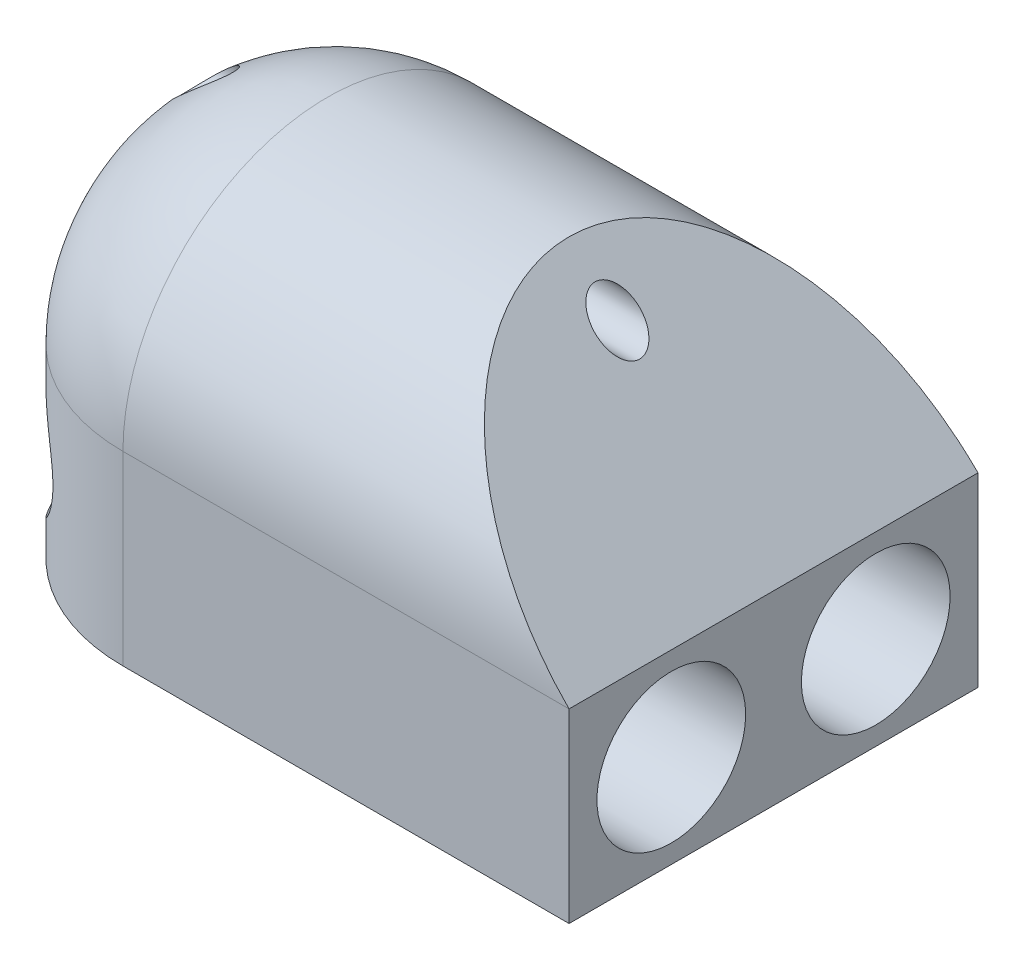
ISO-10303-21;
HEADER;
FILE_DESCRIPTION(('STEP AP214'),'2;1');
FILE_NAME('part.step','',(''),(''),'','','');
FILE_SCHEMA(('AUTOMOTIVE_DESIGN { 1 0 10303 214 1 1 1 1 }'));
ENDSEC;
DATA;
#1=APPLICATION_CONTEXT('core data for automotive mechanical design processes');
#2=APPLICATION_PROTOCOL_DEFINITION('international standard','automotive_design',2000,#1);
#3=PRODUCT_CONTEXT('',#1,'mechanical');
#4=PRODUCT('Part','Part','',(#3));
#5=PRODUCT_RELATED_PRODUCT_CATEGORY('part','',(#4));
#6=PRODUCT_DEFINITION_FORMATION('','',#4);
#7=PRODUCT_DEFINITION_CONTEXT('part definition',#1,'design');
#8=PRODUCT_DEFINITION('design','',#6,#7);
#9=PRODUCT_DEFINITION_SHAPE('','',#8);
#10=(LENGTH_UNIT() NAMED_UNIT(*) SI_UNIT(.MILLI.,.METRE.));
#11=(NAMED_UNIT(*) PLANE_ANGLE_UNIT() SI_UNIT($,.RADIAN.));
#12=(NAMED_UNIT(*) SI_UNIT($,.STERADIAN.) SOLID_ANGLE_UNIT());
#13=UNCERTAINTY_MEASURE_WITH_UNIT(LENGTH_MEASURE(1.E-05),#10,'distance_accuracy_value','');
#14=(GEOMETRIC_REPRESENTATION_CONTEXT(3) GLOBAL_UNCERTAINTY_ASSIGNED_CONTEXT((#13)) GLOBAL_UNIT_ASSIGNED_CONTEXT((#10,
#11,#12)) REPRESENTATION_CONTEXT('',''));
#15=CARTESIAN_POINT('',(0.,0.,0.));
#16=DIRECTION('',(0.,0.,1.));
#17=DIRECTION('',(1.,0.,0.));
#18=AXIS2_PLACEMENT_3D('',#15,#16,#17);
#19=CARTESIAN_POINT('',(0.,6.35,0.));
#20=DIRECTION('',(-1.,0.,0.));
#21=DIRECTION('',(0.,0.,1.));
#22=AXIS2_PLACEMENT_3D('',#19,#20,#21);
#23=PLANE('',#22);
#24=CARTESIAN_POINT('',(0.,3.175,-3.4925));
#25=DIRECTION('',(1.,0.,0.));
#26=DIRECTION('',(0.,0.,-1.));
#27=AXIS2_PLACEMENT_3D('',#24,#25,#26);
#28=CIRCLE('',#27,2.54);
#29=CARTESIAN_POINT('',(0.,3.175,-6.0325));
#30=VERTEX_POINT('',#29);
#31=EDGE_CURVE('E217',#30,#30,#28,.T.);
#32=ORIENTED_EDGE('',*,*,#31,.F.);
#33=EDGE_LOOP('',(#32));
#34=FACE_BOUND('',#33,.T.);
#35=CARTESIAN_POINT('',(0.,3.175,-10.4775));
#36=DIRECTION('',(1.,0.,0.));
#37=DIRECTION('',(0.,0.,1.));
#38=AXIS2_PLACEMENT_3D('',#35,#36,#37);
#39=CIRCLE('',#38,2.54);
#40=CARTESIAN_POINT('',(0.,3.175,-7.9375));
#41=VERTEX_POINT('',#40);
#42=EDGE_CURVE('E148',#41,#41,#39,.T.);
#43=ORIENTED_EDGE('',*,*,#42,.F.);
#44=EDGE_LOOP('',(#43));
#45=FACE_BOUND('',#44,.T.);
#46=DIRECTION('',(0.,-1.,0.));
#47=VECTOR('',#46,1.);
#48=CARTESIAN_POINT('',(0.,6.35,-13.97));
#49=LINE('',#48,#47);
#50=CARTESIAN_POINT('',(0.,6.35,-13.97));
#51=VERTEX_POINT('',#50);
#52=CARTESIAN_POINT('',(0.,0.,-13.97));
#53=VERTEX_POINT('',#52);
#54=EDGE_CURVE('E105',#51,#53,#49,.T.);
#55=ORIENTED_EDGE('',*,*,#54,.F.);
#56=DIRECTION('',(0.,0.,1.));
#57=VECTOR('',#56,1.);
#58=CARTESIAN_POINT('',(0.,6.35,-13.97));
#59=LINE('',#58,#57);
#60=CARTESIAN_POINT('',(0.,6.35,0.));
#61=VERTEX_POINT('',#60);
#62=EDGE_CURVE('E107',#51,#61,#59,.T.);
#63=ORIENTED_EDGE('',*,*,#62,.T.);
#64=DIRECTION('',(0.,-1.,0.));
#65=VECTOR('',#64,1.);
#66=CARTESIAN_POINT('',(0.,6.35,0.));
#67=LINE('',#66,#65);
#68=CARTESIAN_POINT('',(0.,0.,0.));
#69=VERTEX_POINT('',#68);
#70=EDGE_CURVE('E122',#61,#69,#67,.T.);
#71=ORIENTED_EDGE('',*,*,#70,.T.);
#72=DIRECTION('',(0.,0.,-1.));
#73=VECTOR('',#72,1.);
#74=CARTESIAN_POINT('',(0.,0.,0.));
#75=LINE('',#74,#73);
#76=EDGE_CURVE('E113',#69,#53,#75,.T.);
#77=ORIENTED_EDGE('',*,*,#76,.T.);
#78=EDGE_LOOP('',(#55,#63,#71,#77));
#79=FACE_BOUND('',#78,.T.);
#80=ADVANCED_FACE('F35',(#34,#45,#79),#23,.F.);
#81=CARTESIAN_POINT('',(0.,6.35,-13.97));
#82=DIRECTION('',(0.,0.,1.));
#83=DIRECTION('',(1.,0.,0.));
#84=AXIS2_PLACEMENT_3D('',#81,#82,#83);
#85=PLANE('',#84);
#86=DIRECTION('',(-1.,0.,0.));
#87=VECTOR('',#86,1.);
#88=CARTESIAN_POINT('',(0.,0.,-13.97));
#89=LINE('',#88,#87);
#90=CARTESIAN_POINT('',(-15.24,0.,-13.97));
#91=VERTEX_POINT('',#90);
#92=EDGE_CURVE('E222',#53,#91,#89,.T.);
#93=ORIENTED_EDGE('',*,*,#92,.T.);
#94=DIRECTION('',(0.,-1.,0.));
#95=VECTOR('',#94,1.);
#96=CARTESIAN_POINT('',(-15.24,6.35,-13.97));
#97=LINE('',#96,#95);
#98=CARTESIAN_POINT('',(-15.24,6.35,-13.97));
#99=VERTEX_POINT('',#98);
#100=EDGE_CURVE('E50',#91,#99,#97,.F.);
#101=ORIENTED_EDGE('',*,*,#100,.T.);
#102=DIRECTION('',(-1.,0.,0.));
#103=VECTOR('',#102,1.);
#104=CARTESIAN_POINT('',(0.,6.35,-13.97));
#105=LINE('',#104,#103);
#106=EDGE_CURVE('E98',#51,#99,#105,.T.);
#107=ORIENTED_EDGE('',*,*,#106,.F.);
#108=ORIENTED_EDGE('',*,*,#54,.T.);
#109=EDGE_LOOP('',(#93,#101,#107,#108));
#110=FACE_BOUND('',#109,.T.);
#111=ADVANCED_FACE('F117',(#110),#85,.F.);
#112=CARTESIAN_POINT('',(-21.59,6.35,0.));
#113=DIRECTION('',(1.,0.,0.));
#114=DIRECTION('',(0.,0.,-1.));
#115=AXIS2_PLACEMENT_3D('',#112,#113,#114);
#116=PLANE('',#115);
#117=DIRECTION('',(0.,0.,1.));
#118=VECTOR('',#117,1.);
#119=CARTESIAN_POINT('',(-21.59,0.,0.));
#120=LINE('',#119,#118);
#121=CARTESIAN_POINT('',(-21.59,0.,-7.62));
#122=VERTEX_POINT('',#121);
#123=CARTESIAN_POINT('',(-21.59,0.,-6.35));
#124=VERTEX_POINT('',#123);
#125=EDGE_CURVE('E224',#122,#124,#120,.T.);
#126=ORIENTED_EDGE('',*,*,#125,.T.);
#127=DIRECTION('',(0.,-1.,0.));
#128=VECTOR('',#127,1.);
#129=CARTESIAN_POINT('',(-21.59,6.35,-6.35));
#130=LINE('',#129,#128);
#131=CARTESIAN_POINT('',(-21.59,6.35,-6.35));
#132=VERTEX_POINT('',#131);
#133=EDGE_CURVE('E139',#124,#132,#130,.F.);
#134=ORIENTED_EDGE('',*,*,#133,.T.);
#135=CARTESIAN_POINT('',(-21.59,6.35,-6.985));
#136=DIRECTION('',(1.,0.,0.));
#137=DIRECTION('',(0.,0.,-1.));
#138=AXIS2_PLACEMENT_3D('',#135,#136,#137);
#139=CIRCLE('',#138,0.635000000000001);
#140=CARTESIAN_POINT('',(-21.59,6.35,-7.62));
#141=VERTEX_POINT('',#140);
#142=EDGE_CURVE('E65',#132,#141,#139,.F.);
#143=ORIENTED_EDGE('',*,*,#142,.T.);
#144=DIRECTION('',(0.,-1.,0.));
#145=VECTOR('',#144,1.);
#146=CARTESIAN_POINT('',(-21.59,6.35,-7.62));
#147=LINE('',#146,#145);
#148=EDGE_CURVE('E137',#141,#122,#147,.T.);
#149=ORIENTED_EDGE('',*,*,#148,.T.);
#150=EDGE_LOOP('',(#126,#134,#143,#149));
#151=FACE_BOUND('',#150,.T.);
#152=ADVANCED_FACE('F176',(#151),#116,.F.);
#153=CARTESIAN_POINT('',(0.,6.35,0.));
#154=DIRECTION('',(0.,0.,-1.));
#155=DIRECTION('',(-1.,0.,0.));
#156=AXIS2_PLACEMENT_3D('',#153,#154,#155);
#157=PLANE('',#156);
#158=DIRECTION('',(1.,0.,0.));
#159=VECTOR('',#158,1.);
#160=CARTESIAN_POINT('',(0.,6.35,0.));
#161=LINE('',#160,#159);
#162=CARTESIAN_POINT('',(-15.24,6.35,0.));
#163=VERTEX_POINT('',#162);
#164=EDGE_CURVE('E101',#163,#61,#161,.T.);
#165=ORIENTED_EDGE('',*,*,#164,.F.);
#166=DIRECTION('',(0.,-1.,0.));
#167=VECTOR('',#166,1.);
#168=CARTESIAN_POINT('',(-15.24,6.35,0.));
#169=LINE('',#168,#167);
#170=CARTESIAN_POINT('',(-15.24,0.,0.));
#171=VERTEX_POINT('',#170);
#172=EDGE_CURVE('E104',#163,#171,#169,.T.);
#173=ORIENTED_EDGE('',*,*,#172,.T.);
#174=DIRECTION('',(1.,0.,0.));
#175=VECTOR('',#174,1.);
#176=CARTESIAN_POINT('',(0.,0.,0.));
#177=LINE('',#176,#175);
#178=EDGE_CURVE('E119',#171,#69,#177,.T.);
#179=ORIENTED_EDGE('',*,*,#178,.T.);
#180=ORIENTED_EDGE('',*,*,#70,.F.);
#181=EDGE_LOOP('',(#165,#173,#179,#180));
#182=FACE_BOUND('',#181,.T.);
#183=ADVANCED_FACE('F179',(#182),#157,.F.);
#184=CARTESIAN_POINT('',(0.,0.,0.));
#185=DIRECTION('',(0.,1.,0.));
#186=DIRECTION('',(0.,0.,1.));
#187=AXIS2_PLACEMENT_3D('',#184,#185,#186);
#188=PLANE('',#187);
#189=ORIENTED_EDGE('',*,*,#178,.F.);
#190=CARTESIAN_POINT('',(-15.24,0.,-6.35));
#191=DIRECTION('',(0.,1.,0.));
#192=DIRECTION('',(0.,0.,1.));
#193=AXIS2_PLACEMENT_3D('',#190,#191,#192);
#194=CIRCLE('',#193,6.35);
#195=EDGE_CURVE('E134',#171,#124,#194,.F.);
#196=ORIENTED_EDGE('',*,*,#195,.T.);
#197=ORIENTED_EDGE('',*,*,#125,.F.);
#198=CARTESIAN_POINT('',(-15.24,0.,-7.62));
#199=DIRECTION('',(0.,1.,0.));
#200=DIRECTION('',(0.,0.,1.));
#201=AXIS2_PLACEMENT_3D('',#198,#199,#200);
#202=CIRCLE('',#201,6.35);
#203=EDGE_CURVE('E132',#122,#91,#202,.F.);
#204=ORIENTED_EDGE('',*,*,#203,.T.);
#205=ORIENTED_EDGE('',*,*,#92,.F.);
#206=ORIENTED_EDGE('',*,*,#76,.F.);
#207=EDGE_LOOP('',(#189,#196,#197,#204,#205,#206));
#208=FACE_BOUND('',#207,.T.);
#209=ADVANCED_FACE('F182',(#208),#188,.F.);
#210=CARTESIAN_POINT('',(-37.208934822836,6.35,-6.985));
#211=DIRECTION('',(1.,0.,0.));
#212=DIRECTION('',(0.,0.,-1.));
#213=AXIS2_PLACEMENT_3D('',#210,#211,#212);
#214=CYLINDRICAL_SURFACE('',#213,6.985);
#215=ORIENTED_EDGE('',*,*,#106,.T.);
#216=CARTESIAN_POINT('',(-15.24,6.35,-6.985));
#217=DIRECTION('',(1.,0.,0.));
#218=DIRECTION('',(0.,0.,-1.));
#219=AXIS2_PLACEMENT_3D('',#216,#217,#218);
#220=CIRCLE('',#219,6.985);
#221=EDGE_CURVE('E11',#99,#163,#220,.T.);
#222=ORIENTED_EDGE('',*,*,#221,.T.);
#223=ORIENTED_EDGE('',*,*,#164,.T.);
#224=CARTESIAN_POINT('',(0.,6.35,-6.985));
#225=DIRECTION('',(-0.707106781186551,-0.707106781186544,0.));
#226=DIRECTION('',(0.707106781186544,-0.707106781186551,0.));
#227=AXIS2_PLACEMENT_3D('',#224,#225,#226);
#228=ELLIPSE('',#227,9.87828173317602,6.985);
#229=EDGE_CURVE('E95',#51,#61,#228,.F.);
#230=ORIENTED_EDGE('',*,*,#229,.F.);
#231=EDGE_LOOP('',(#215,#222,#223,#230));
#232=FACE_BOUND('',#231,.T.);
#233=ADVANCED_FACE('F97',(#232),#214,.T.);
#234=CARTESIAN_POINT('',(-6.98499999999993,13.335,-13.97));
#235=DIRECTION('',(-0.707106781186551,-0.707106781186544,0.));
#236=DIRECTION('',(0.707106781186544,-0.707106781186551,0.));
#237=AXIS2_PLACEMENT_3D('',#234,#235,#236);
#238=PLANE('',#237);
#239=CARTESIAN_POINT('',(-5.33399999999994,11.684,-6.985));
#240=DIRECTION('',(-0.707106781186551,-0.707106781186544,0.));
#241=DIRECTION('',(0.707106781186544,-0.707106781186551,0.));
#242=AXIS2_PLACEMENT_3D('',#239,#240,#241);
#243=ELLIPSE('',#242,1.07763073452829,0.761999999999999);
#244=CARTESIAN_POINT('',(-4.57199999999995,10.922,-6.985));
#245=VERTEX_POINT('',#244);
#246=EDGE_CURVE('E114',#245,#245,#243,.T.);
#247=ORIENTED_EDGE('',*,*,#246,.T.);
#248=EDGE_LOOP('',(#247));
#249=FACE_BOUND('',#248,.T.);
#250=ORIENTED_EDGE('',*,*,#62,.F.);
#251=ORIENTED_EDGE('',*,*,#229,.T.);
#252=EDGE_LOOP('',(#250,#251));
#253=FACE_BOUND('',#252,.T.);
#254=ADVANCED_FACE('F108',(#249,#253),#238,.F.);
#255=CARTESIAN_POINT('',(-21.59,11.684,-6.985));
#256=DIRECTION('',(1.,0.,0.));
#257=DIRECTION('',(0.,0.,-1.));
#258=AXIS2_PLACEMENT_3D('',#255,#256,#257);
#259=CYLINDRICAL_SURFACE('',#258,0.761999999999999);
#260=CARTESIAN_POINT('',(-20.1329889552225,11.0177398715929,-6.61521433059817));
#261=CARTESIAN_POINT('',(-20.1473147654643,11.0025368702923,-6.6426066452092));
#262=CARTESIAN_POINT('',(-20.1602627267399,10.9887156003994,-6.67149653166573));
#263=CARTESIAN_POINT('',(-20.1828467858342,10.9645211202767,-6.73191643652233));
#264=CARTESIAN_POINT('',(-20.1924840030099,10.9541467446969,-6.76344555810875));
#265=CARTESIAN_POINT('',(-20.2079669796131,10.9374430130126,-6.8286803595741));
#266=CARTESIAN_POINT('',(-20.2137900890202,10.9311378249063,-6.86239775817262));
#267=CARTESIAN_POINT('',(-20.2211642978291,10.9231484996769,-6.9308342852703));
#268=CARTESIAN_POINT('',(-20.2227172703951,10.9214623363455,-6.96555296778412));
#269=CARTESIAN_POINT('',(-20.2214913541261,10.9227918776532,-7.03238319461969));
#270=CARTESIAN_POINT('',(-20.2190074664659,10.9254873862005,-7.06450745559522));
#271=CARTESIAN_POINT('',(-20.2104101643601,10.9347956500465,-7.12767615615698));
#272=CARTESIAN_POINT('',(-20.2042964648204,10.9414087130392,-7.15872051072199));
#273=CARTESIAN_POINT('',(-20.1887564210133,10.9581589885037,-7.21905712189536));
#274=CARTESIAN_POINT('',(-20.1793205861095,10.9683062966628,-7.24834407441999));
#275=CARTESIAN_POINT('',(-20.1575831417342,10.99157623565,-7.30456346440193));
#276=CARTESIAN_POINT('',(-20.1452802042902,11.0047002451385,-7.33149480282174));
#277=CARTESIAN_POINT('',(-20.1125742360157,11.0393981601274,-7.39349654657636));
#278=CARTESIAN_POINT('',(-20.0909400388839,11.0622052154469,-7.42723056166612));
#279=CARTESIAN_POINT('',(-20.0439687332056,11.1112603065839,-7.48916439129111));
#280=CARTESIAN_POINT('',(-20.01862423781,11.1375151957152,-7.51735289655151));
#281=CARTESIAN_POINT('',(-19.9554145241481,11.2023142156136,-7.57764819233216));
#282=CARTESIAN_POINT('',(-19.9163544323111,11.2418476415243,-7.60743345049744));
#283=CARTESIAN_POINT('',(-19.8347977820978,11.3230993831986,-7.65782016769091));
#284=CARTESIAN_POINT('',(-19.7922960441353,11.3648209575308,-7.67840746879085));
#285=CARTESIAN_POINT('',(-19.6889283745856,11.4645985322762,-7.7173500867182));
#286=CARTESIAN_POINT('',(-19.6270575562371,11.5230184132117,-7.73209954473631));
#287=CARTESIAN_POINT('',(-19.5009979383026,11.6391677958287,-7.74793909557579));
#288=CARTESIAN_POINT('',(-19.4368062902454,11.6968963247845,-7.74901178915365));
#289=CARTESIAN_POINT('',(-19.3061557853619,11.811439508503,-7.73851363266424));
#290=CARTESIAN_POINT('',(-19.2396780756737,11.8682063861891,-7.72666509425043));
#291=CARTESIAN_POINT('',(-19.1073092095658,11.9782507535164,-7.69028160821014));
#292=CARTESIAN_POINT('',(-19.0414176987917,12.0315304953465,-7.66575494177011));
#293=CARTESIAN_POINT('',(-18.9298755248859,12.1193418843881,-7.61189698208735));
#294=CARTESIAN_POINT('',(-18.8836065763043,12.1550230851112,-7.58570140936129));
#295=CARTESIAN_POINT('',(-18.7937100863807,12.2230296063985,-7.5255126595865));
#296=CARTESIAN_POINT('',(-18.7500781965238,12.2553605182149,-7.49153278826429));
#297=CARTESIAN_POINT('',(-18.6826628350842,12.3044403697459,-7.42846803609767));
#298=CARTESIAN_POINT('',(-18.657408089141,12.3225957733037,-7.4020575703599));
#299=CARTESIAN_POINT('',(-18.6099694851332,12.3563477504432,-7.34511878370255));
#300=CARTESIAN_POINT('',(-18.5877811816663,12.3719480343758,-7.31459655317916));
#301=CARTESIAN_POINT('',(-18.5534195677978,12.3959045205437,-7.25796498464362));
#302=CARTESIAN_POINT('',(-18.5401569612958,12.4050810246921,-7.23287198758521));
#303=CARTESIAN_POINT('',(-18.5170170333141,12.4210153054996,-7.18044629770925));
#304=CARTESIAN_POINT('',(-18.5071343303375,12.4277769279112,-7.15311725194411));
#305=CARTESIAN_POINT('',(-18.4929595714311,12.4374480490623,-7.1013395253331));
#306=CARTESIAN_POINT('',(-18.4880154372831,12.4408081432442,-7.07715615109019));
#307=CARTESIAN_POINT('',(-18.4815842752782,12.4451756222142,-7.02812610923704));
#308=CARTESIAN_POINT('',(-18.4800947931355,12.4461846772515,-7.00327992520744));
#309=CARTESIAN_POINT('',(-18.4807222560636,12.4457591516874,-6.95363547601046));
#310=CARTESIAN_POINT('',(-18.4828420999193,12.4443226069333,-6.92883726538834));
#311=CARTESIAN_POINT('',(-18.4904778158115,12.4391340420749,-6.88001948248018));
#312=CARTESIAN_POINT('',(-18.495996377164,12.4353801883392,-6.85600054266977));
#313=CARTESIAN_POINT('',(-18.5118486573908,12.4245522251221,-6.80294455902321));
#314=CARTESIAN_POINT('',(-18.5230807250685,12.416854908322,-6.77430603628081));
#315=CARTESIAN_POINT('',(-18.5491354327945,12.3988710232801,-6.71959981035989));
#316=CARTESIAN_POINT('',(-18.5639651901392,12.388579320977,-6.69353734904616));
#317=CARTESIAN_POINT('',(-18.6045541062172,12.3601731859638,-6.63125143086778));
#318=CARTESIAN_POINT('',(-18.6320024489638,12.3407636514473,-6.59673135475861));
#319=CARTESIAN_POINT('',(-18.6905284033487,12.2987713384003,-6.53316461569313));
#320=CARTESIAN_POINT('',(-18.7216148943108,12.2761807677105,-6.50413181597393));
#321=CARTESIAN_POINT('',(-18.8060651532455,12.2138652619312,-6.43432164171098));
#322=CARTESIAN_POINT('',(-18.861256738463,12.172223875497,-6.39747411789326));
#323=CARTESIAN_POINT('',(-18.9743035694427,12.0847239346623,-6.33464552681543));
#324=CARTESIAN_POINT('',(-19.0321622970555,12.0388597850188,-6.30867913754391));
#325=CARTESIAN_POINT('',(-19.1519156586147,11.9415387521021,-6.26577408823542));
#326=CARTESIAN_POINT('',(-19.21386516886,11.8899157089521,-6.24936626672035));
#327=CARTESIAN_POINT('',(-19.3375744980436,11.7841940896497,-6.22769274570536));
#328=CARTESIAN_POINT('',(-19.3993343601759,11.730096129983,-6.2224242867352));
#329=CARTESIAN_POINT('',(-19.52053348534,11.6213654024303,-6.22366521480188));
#330=CARTESIAN_POINT('',(-19.5799940585408,11.5667549823341,-6.22998780349363));
#331=CARTESIAN_POINT('',(-19.6962846431294,11.457570056086,-6.25526860601316));
#332=CARTESIAN_POINT('',(-19.7531172889846,11.4029955705158,-6.27421385859536));
#333=CARTESIAN_POINT('',(-19.845978495267,11.3120320446542,-6.31864548794035));
#334=CARTESIAN_POINT('',(-19.8831687293952,11.2750602692727,-6.34051253550249));
#335=CARTESIAN_POINT('',(-19.9542844011221,11.203452201412,-6.39199485563403));
#336=CARTESIAN_POINT('',(-19.988216477909,11.1688112045515,-6.42159389381919));
#337=CARTESIAN_POINT('',(-20.0412045588549,11.1141172157744,-6.47816050191591));
#338=CARTESIAN_POINT('',(-20.06152443463,11.0929674648988,-6.50288765763814));
#339=CARTESIAN_POINT('',(-20.0994582183004,11.0532244124144,-6.55620020945532));
#340=CARTESIAN_POINT('',(-20.1170738479775,11.0346294849594,-6.58478312863701));
#341=CARTESIAN_POINT('',(-20.1329889552225,11.0177398715929,-6.61521433059817));
#342=B_SPLINE_CURVE_WITH_KNOTS('',3,(#260,#261,#262,#263,#264,#265,#266,#267,#268,#269,#270,
#271,#272,#273,#274,#275,#276,#277,#278,#279,#280,#281,#282,#283,#284,#285,#286,#287,#288,#289,
#290,#291,#292,#293,#294,#295,#296,#297,#298,#299,#300,#301,#302,#303,#304,#305,#306,#307,#308,
#309,#310,#311,#312,#313,#314,#315,#316,#317,#318,#319,#320,#321,#322,#323,#324,#325,#326,#327,
#328,#329,#330,#331,#332,#333,#334,#335,#336,#337,#338,#339,#340,#341),.UNSPECIFIED.,.T.,.F.,(4,
2,2,2,2,2,2,2,2,2,2,2,2,2,2,2,2,2,2,2,2,2,2,2,2,2,2,2,2,2,2,2,2,2,2,2,2,2,2,2,4),(0.,
0.103249177174873,0.206463411541045,0.310285154815412,0.41406134773929,0.510588833003001,
0.607123900770229,0.703937016895179,0.800795063945885,0.93836096393719,1.07620456609986,
1.26433039765956,1.45274481203429,1.71045750537875,1.96849802181173,2.23219532428447,
2.49572060039395,2.68735983666743,2.87867391574023,3.00079501560259,3.12273717732717,
3.21192986452859,3.3009798702989,3.37538704169102,3.44974133583771,3.52415537487637,
3.59862837158064,3.69323179947853,3.78802392942527,3.93176937062796,4.07587325767343,
4.30962543232356,4.54369191723868,4.78975360974777,5.03575434010547,5.27782538320386,
5.5196482444007,5.68957535662583,5.85914851169798,5.97392547597728,6.08862905643585),.UNSPECIFIED.);
#343=CARTESIAN_POINT('',(-20.1329889552225,11.0177398715929,-6.61521433059817));
#344=VERTEX_POINT('',#343);
#345=EDGE_CURVE('E129',#344,#344,#342,.T.);
#346=ORIENTED_EDGE('',*,*,#345,.F.);
#347=EDGE_LOOP('',(#346));
#348=FACE_BOUND('',#347,.T.);
#349=ORIENTED_EDGE('',*,*,#246,.F.);
#350=EDGE_LOOP('',(#349));
#351=FACE_BOUND('',#350,.T.);
#352=ADVANCED_FACE('F159',(#348,#351),#259,.F.);
#353=CARTESIAN_POINT('',(-21.59,3.175,-10.4775));
#354=DIRECTION('',(1.,0.,0.));
#355=DIRECTION('',(0.,0.,-1.));
#356=AXIS2_PLACEMENT_3D('',#353,#354,#355);
#357=CYLINDRICAL_SURFACE('',#356,2.54);
#358=CARTESIAN_POINT('',(-18.5850700665307,3.175,-13.0175));
#359=CARTESIAN_POINT('',(-18.5850809421804,3.25795986417474,-13.0174949547619));
#360=CARTESIAN_POINT('',(-18.5917354479338,3.34105977996412,-13.01338635941));
#361=CARTESIAN_POINT('',(-18.6173640127499,3.50463657637292,-12.997371289707));
#362=CARTESIAN_POINT('',(-18.6363744967878,3.58510496030578,-12.9854417586164));
#363=CARTESIAN_POINT('',(-18.6918022304916,3.76598669076277,-12.9500032906395));
#364=CARTESIAN_POINT('',(-18.7317979044852,3.86480026527602,-12.9240442867067));
#365=CARTESIAN_POINT('',(-18.8232303431952,4.05382143888285,-12.8627075940967));
#366=CARTESIAN_POINT('',(-18.8746958136355,4.14400661958317,-12.8273062292741));
#367=CARTESIAN_POINT('',(-18.9749240278145,4.30069485942869,-12.7557514516065));
#368=CARTESIAN_POINT('',(-19.0225235158373,4.36854846738085,-12.7208652754647));
#369=CARTESIAN_POINT('',(-19.1209908897674,4.49913523421295,-12.6463528501728));
#370=CARTESIAN_POINT('',(-19.1718608632012,4.56186506345324,-12.6067235593421));
#371=CARTESIAN_POINT('',(-19.2757145752334,4.682545900504,-12.5230560963325));
#372=CARTESIAN_POINT('',(-19.3287001528954,4.74049261005099,-12.4790140356989));
#373=CARTESIAN_POINT('',(-19.4358937499511,4.85176822797227,-12.3867588619713));
#374=CARTESIAN_POINT('',(-19.4901022516539,4.9050952727992,-12.3385440811583));
#375=CARTESIAN_POINT('',(-19.660365527194,5.06473260591165,-12.1815347338112));
#376=CARTESIAN_POINT('',(-19.7773976875624,5.16316587891073,-12.0656033939278));
#377=CARTESIAN_POINT('',(-20.0087474385307,5.33876902049955,-11.8164833247777));
#378=CARTESIAN_POINT('',(-20.1230671228825,5.41595581173408,-11.6833084548903));
#379=CARTESIAN_POINT('',(-20.3392405907125,5.54300260629941,-11.4080368996652));
#380=CARTESIAN_POINT('',(-20.441433852784,5.59408950999923,-11.2667816342876));
#381=CARTESIAN_POINT('',(-20.6364318041073,5.67116400366059,-10.9714498364075));
#382=CARTESIAN_POINT('',(-20.7292453634785,5.69717550935491,-10.8173856731062));
#383=CARTESIAN_POINT('',(-20.8880216031293,5.71801750477817,-10.5260675734382));
#384=CARTESIAN_POINT('',(-20.9558938761345,5.71724690801853,-10.3901779725626));
#385=CARTESIAN_POINT('',(-21.0810185757027,5.69284644660257,-10.1155389432187));
#386=CARTESIAN_POINT('',(-21.1382767609774,5.66922902108666,-9.976791111168));
#387=CARTESIAN_POINT('',(-21.2413265644138,5.59745973622845,-9.70048747289704));
#388=CARTESIAN_POINT('',(-21.2870605655027,5.54918811181253,-9.56294085084886));
#389=CARTESIAN_POINT('',(-21.3665708583089,5.42797068877615,-9.29544248330541));
#390=CARTESIAN_POINT('',(-21.4003495632783,5.35502987560744,-9.1654892094716));
#391=CARTESIAN_POINT('',(-21.4545706824809,5.19346950829459,-8.9295867239484));
#392=CARTESIAN_POINT('',(-21.4759146348194,5.10675453305588,-8.82253336470089));
#393=CARTESIAN_POINT('',(-21.5110582211135,4.91639627206393,-8.62328394362478));
#394=CARTESIAN_POINT('',(-21.5248583457108,4.81275408780605,-8.53108691583296));
#395=CARTESIAN_POINT('',(-21.5466576509295,4.59245855643819,-8.36533241411755));
#396=CARTESIAN_POINT('',(-21.5547074563642,4.47592945760539,-8.29161607718605));
#397=CARTESIAN_POINT('',(-21.5669867120446,4.23232726352204,-8.16393670809778));
#398=CARTESIAN_POINT('',(-21.5712158212732,4.10525322818583,-8.10997543943963));
#399=CARTESIAN_POINT('',(-21.5774012897801,3.84088824194791,-8.02229265812531));
#400=CARTESIAN_POINT('',(-21.579301307443,3.70342635364949,-7.98908207736849));
#401=CARTESIAN_POINT('',(-21.5816689662595,3.42488492154255,-7.94589485899465));
#402=CARTESIAN_POINT('',(-21.5821365050647,3.28380511996598,-7.93591988153708));
#403=CARTESIAN_POINT('',(-21.5819572318703,3.00039448671188,-7.93950605816407));
#404=CARTESIAN_POINT('',(-21.5812981702897,2.858066857992,-7.95332594684907));
#405=CARTESIAN_POINT('',(-21.5783930563319,2.57774514619026,-8.00460888363548));
#406=CARTESIAN_POINT('',(-21.5761469251448,2.43975127866817,-8.0420731058487));
#407=CARTESIAN_POINT('',(-21.5688963460762,2.17203151441948,-8.13956320159891));
#408=CARTESIAN_POINT('',(-21.563891650262,2.04230636203327,-8.19959110294749));
#409=CARTESIAN_POINT('',(-21.5493993326726,1.79491914662104,-8.34039311488771));
#410=CARTESIAN_POINT('',(-21.5399120841748,1.67725608013656,-8.4211654977598));
#411=CARTESIAN_POINT('',(-21.5145922550477,1.45874569910401,-8.59980118114789));
#412=CARTESIAN_POINT('',(-21.4988339127803,1.35772053779292,-8.6974572182981));
#413=CARTESIAN_POINT('',(-21.4591038791106,1.17379222060973,-8.90708681396687));
#414=CARTESIAN_POINT('',(-21.4351344854251,1.09088400565153,-9.01905636161549));
#415=CARTESIAN_POINT('',(-21.3782569330602,0.947023534307901,-9.25037680554756));
#416=CARTESIAN_POINT('',(-21.3455762494604,0.885593626191392,-9.36948714379299));
#417=CARTESIAN_POINT('',(-21.2704278147227,0.782929788239742,-9.61315969673047));
#418=CARTESIAN_POINT('',(-21.2279603104415,0.741695349088513,-9.73772177384705));
#419=CARTESIAN_POINT('',(-21.1329453862317,0.678936786783555,-9.98937991232005));
#420=CARTESIAN_POINT('',(-21.0803029558572,0.657610463655573,-10.1164888467059));
#421=CARTESIAN_POINT('',(-20.9660734542721,0.634188028329436,-10.3684074119049));
#422=CARTESIAN_POINT('',(-20.9044825973837,0.632100079228122,-10.4932160442552));
#423=CARTESIAN_POINT('',(-20.7673240737483,0.646045105451518,-10.7495868502523));
#424=CARTESIAN_POINT('',(-20.6909804344684,0.663853002794689,-10.8806321027495));
#425=CARTESIAN_POINT('',(-20.5311081271842,0.717919577751602,-11.1341397273489));
#426=CARTESIAN_POINT('',(-20.4475781609387,0.754181595023033,-11.2566005413524));
#427=CARTESIAN_POINT('',(-20.2597862284318,0.850830706886154,-11.5127888444006));
#428=CARTESIAN_POINT('',(-20.1545027224843,0.914389966536967,-11.6445631054874));
#429=CARTESIAN_POINT('',(-19.9397690344797,1.06127232429962,-11.8933751151072));
#430=CARTESIAN_POINT('',(-19.8303095717942,1.14464188963963,-12.0103772106205));
#431=CARTESIAN_POINT('',(-19.6550822388233,1.29250772811921,-12.1848844927254));
#432=CARTESIAN_POINT('',(-19.5893636869808,1.35120063016944,-12.2474584343698));
#433=CARTESIAN_POINT('',(-19.4587567945193,1.47516526194394,-12.3668314803553));
#434=CARTESIAN_POINT('',(-19.3938688930136,1.5404403215192,-12.4236276322862));
#435=CARTESIAN_POINT('',(-19.2663635521206,1.6775542138975,-12.5309900748664));
#436=CARTESIAN_POINT('',(-19.2037405706751,1.7493752623916,-12.5815724173671));
#437=CARTESIAN_POINT('',(-19.0823211024812,1.90012377329609,-12.6761818826801));
#438=CARTESIAN_POINT('',(-19.0235204286234,1.97904322587481,-12.7202162489203));
#439=CARTESIAN_POINT('',(-18.9158960639693,2.13911916253917,-12.7982625856645));
#440=CARTESIAN_POINT('',(-18.8666669025612,2.21976548185802,-12.8327503060261));
#441=CARTESIAN_POINT('',(-18.776604938155,2.38832498841458,-12.8942672177071));
#442=CARTESIAN_POINT('',(-18.7357618135295,2.47622905351432,-12.9213055919547));
#443=CARTESIAN_POINT('',(-18.6724030016384,2.6435098021045,-12.9624990328343));
#444=CARTESIAN_POINT('',(-18.6479508651316,2.72179015658698,-12.9780638098456));
#445=CARTESIAN_POINT('',(-18.6102936172506,2.8820169221152,-13.0018338439263));
#446=CARTESIAN_POINT('',(-18.5970534069786,2.96395104081247,-13.0100620723505));
#447=CARTESIAN_POINT('',(-18.588568361659,3.06785944841341,-13.0153304423298));
#448=CARTESIAN_POINT('',(-18.5872594453957,3.08925499591203,-13.0161426559105));
#449=CARTESIAN_POINT('',(-18.5855088363826,3.13209723547001,-13.0172281213903));
#450=CARTESIAN_POINT('',(-18.5850672537409,3.15354393367699,-13.0175013048595));
#451=CARTESIAN_POINT('',(-18.5850700665307,3.175,-13.0175));
#452=B_SPLINE_CURVE_WITH_KNOTS('',3,(#358,#359,#360,#361,#362,#363,#364,#365,#366,#367,#368,
#369,#370,#371,#372,#373,#374,#375,#376,#377,#378,#379,#380,#381,#382,#383,#384,#385,#386,#387,
#388,#389,#390,#391,#392,#393,#394,#395,#396,#397,#398,#399,#400,#401,#402,#403,#404,#405,#406,
#407,#408,#409,#410,#411,#412,#413,#414,#415,#416,#417,#418,#419,#420,#421,#422,#423,#424,#425,
#426,#427,#428,#429,#430,#431,#432,#433,#434,#435,#436,#437,#438,#439,#440,#441,#442,#443,#444,
#445,#446,#447,#448,#449,#450,#451),.UNSPECIFIED.,.T.,.F.,(4,2,2,2,2,2,2,2,2,2,2,2,2,2,2,2,2,2,
2,2,2,2,2,2,2,2,2,2,2,2,2,2,2,2,2,2,2,2,2,2,2,2,2,2,2,2,4),(0.,0.248785343534789,
0.498307444226517,0.825593683059696,1.15370841539568,1.42313156040346,1.69272841718364,
1.96256496290943,2.23250985720991,2.8061069898095,3.37924592634019,3.92214612578951,
4.46452801882621,4.91832222252369,5.37186949327899,5.82764126200655,6.28332097777702,
6.69954243658074,7.11573682160798,7.52822036965985,7.94074073038651,8.36305483447512,
8.78539911153723,9.21236482140635,9.63935173487314,10.0663770310924,10.4933667737194,
10.9154453306313,11.3374058727166,11.7492754055882,12.1611345508533,12.5770435395603,
12.9931289958357,13.4495196435711,13.905992914094,14.444818841098,14.9849213408426,
15.3088297986306,15.6329029486388,15.9561204983131,16.2789777987343,16.5800525422535,
16.8807544684086,17.1302589287586,17.3789793979534,17.4433150542238,17.5076588773987),.UNSPECIFIED.);
#453=CARTESIAN_POINT('',(-18.5850700665307,3.175,-13.0175));
#454=VERTEX_POINT('',#453);
#455=EDGE_CURVE('E154',#454,#454,#452,.T.);
#456=ORIENTED_EDGE('',*,*,#455,.F.);
#457=EDGE_LOOP('',(#456));
#458=FACE_BOUND('',#457,.T.);
#459=ORIENTED_EDGE('',*,*,#42,.T.);
#460=EDGE_LOOP('',(#459));
#461=FACE_BOUND('',#460,.T.);
#462=ADVANCED_FACE('F193',(#458,#461),#357,.F.);
#463=CARTESIAN_POINT('',(-21.59,3.175,-3.4925));
#464=DIRECTION('',(1.,0.,0.));
#465=DIRECTION('',(0.,0.,-1.));
#466=AXIS2_PLACEMENT_3D('',#463,#464,#465);
#467=CYLINDRICAL_SURFACE('',#466,2.54);
#468=CARTESIAN_POINT('',(-18.5850700665307,3.175,-0.9525));
#469=CARTESIAN_POINT('',(-18.5850809421804,3.09204013582526,-0.952505045238099));
#470=CARTESIAN_POINT('',(-18.5917354479338,3.00894022003588,-0.956613640589964));
#471=CARTESIAN_POINT('',(-18.6173640127499,2.84536342362708,-0.972628710292989));
#472=CARTESIAN_POINT('',(-18.6363744967878,2.76489503969422,-0.98455824138359));
#473=CARTESIAN_POINT('',(-18.6918022304916,2.58401330923723,-1.01999670936055));
#474=CARTESIAN_POINT('',(-18.7317979044852,2.48519973472398,-1.04595571329332));
#475=CARTESIAN_POINT('',(-18.8232303431952,2.29617856111714,-1.10729240590331));
#476=CARTESIAN_POINT('',(-18.8746958136355,2.20599338041683,-1.14269377072588));
#477=CARTESIAN_POINT('',(-18.9749240278145,2.04930514057131,-1.21424854839347));
#478=CARTESIAN_POINT('',(-19.0225235158373,1.98145153261915,-1.24913472453533));
#479=CARTESIAN_POINT('',(-19.1209908897674,1.85086476578705,-1.32364714982719));
#480=CARTESIAN_POINT('',(-19.1718608632012,1.78813493654676,-1.36327644065791));
#481=CARTESIAN_POINT('',(-19.2757145752334,1.66745409949599,-1.4469439036675));
#482=CARTESIAN_POINT('',(-19.3287001528955,1.60950738994901,-1.49098596430107));
#483=CARTESIAN_POINT('',(-19.4358937499511,1.49823177202773,-1.58324113802872));
#484=CARTESIAN_POINT('',(-19.4901022516539,1.4449047272008,-1.63145591884171));
#485=CARTESIAN_POINT('',(-19.6603655271941,1.28526739408834,-1.78846526618881));
#486=CARTESIAN_POINT('',(-19.7773976875624,1.18683412108927,-1.90439660607221));
#487=CARTESIAN_POINT('',(-20.0087474385307,1.01123097950044,-2.15351667522235));
#488=CARTESIAN_POINT('',(-20.1230671228825,0.93404418826592,-2.28669154510969));
#489=CARTESIAN_POINT('',(-20.3392405907125,0.806997393700588,-2.56196310033481));
#490=CARTESIAN_POINT('',(-20.441433852784,0.755910490000768,-2.70321836571237));
#491=CARTESIAN_POINT('',(-20.6364318041073,0.678835996339408,-2.9985501635925));
#492=CARTESIAN_POINT('',(-20.7292453634785,0.652824490645087,-3.15261432689378));
#493=CARTESIAN_POINT('',(-20.8880216031293,0.631982495221827,-3.44393242656178));
#494=CARTESIAN_POINT('',(-20.9558938761345,0.632753091981468,-3.57982202743744));
#495=CARTESIAN_POINT('',(-21.0810185757027,0.657153553397434,-3.85446105678129));
#496=CARTESIAN_POINT('',(-21.1382767609774,0.680770978913336,-3.99320888883201));
#497=CARTESIAN_POINT('',(-21.2413265644138,0.752540263771551,-4.26951252710297));
#498=CARTESIAN_POINT('',(-21.2870605655027,0.800811888187469,-4.40705914915116));
#499=CARTESIAN_POINT('',(-21.3665708583089,0.922029311223858,-4.6745575166946));
#500=CARTESIAN_POINT('',(-21.4003495632783,0.994970124392564,-4.80451079052841));
#501=CARTESIAN_POINT('',(-21.4545706824809,1.15653049170541,-5.04041327605161));
#502=CARTESIAN_POINT('',(-21.4759146348194,1.24324546694413,-5.14746663529912));
#503=CARTESIAN_POINT('',(-21.5110582211135,1.43360372793608,-5.34671605637523));
#504=CARTESIAN_POINT('',(-21.5248583457108,1.53724591219395,-5.43891308416705));
#505=CARTESIAN_POINT('',(-21.5466576509295,1.75754144356182,-5.60466758588247));
#506=CARTESIAN_POINT('',(-21.5547074563642,1.87407054239461,-5.67838392281396));
#507=CARTESIAN_POINT('',(-21.5669867120446,2.11767273647797,-5.80606329190223));
#508=CARTESIAN_POINT('',(-21.5712158212732,2.24474677181418,-5.86002456056038));
#509=CARTESIAN_POINT('',(-21.5774012897801,2.5091117580521,-5.94770734187469));
#510=CARTESIAN_POINT('',(-21.579301307443,2.64657364635052,-5.98091792263152));
#511=CARTESIAN_POINT('',(-21.5816689662595,2.92511507845746,-6.02410514100536));
#512=CARTESIAN_POINT('',(-21.5821365050647,3.06619488003403,-6.03408011846293));
#513=CARTESIAN_POINT('',(-21.5819572318703,3.34960551328813,-6.03049394183594));
#514=CARTESIAN_POINT('',(-21.5812981702897,3.491933142008,-6.01667405315093));
#515=CARTESIAN_POINT('',(-21.5783930563319,3.77225485380974,-5.96539111636453));
#516=CARTESIAN_POINT('',(-21.5761469251448,3.91024872133184,-5.92792689415131));
#517=CARTESIAN_POINT('',(-21.5688963460762,4.17796848558052,-5.8304367984011));
#518=CARTESIAN_POINT('',(-21.563891650262,4.30769363796674,-5.77040889705251));
#519=CARTESIAN_POINT('',(-21.5493993326726,4.55508085337897,-5.62960688511229));
#520=CARTESIAN_POINT('',(-21.5399120841748,4.67274391986345,-5.5488345022402));
#521=CARTESIAN_POINT('',(-21.5145922550477,4.89125430089599,-5.37019881885211));
#522=CARTESIAN_POINT('',(-21.4988339127803,4.99227946220709,-5.2725427817019));
#523=CARTESIAN_POINT('',(-21.4591038791106,5.17620777939028,-5.06291318603313));
#524=CARTESIAN_POINT('',(-21.4351344854251,5.25911599434848,-4.95094363838451));
#525=CARTESIAN_POINT('',(-21.3782569330602,5.4029764656921,-4.71962319445243));
#526=CARTESIAN_POINT('',(-21.3455762494604,5.46440637380861,-4.60051285620701));
#527=CARTESIAN_POINT('',(-21.2704278147227,5.56707021176026,-4.35684030326953));
#528=CARTESIAN_POINT('',(-21.2279603104415,5.60830465091149,-4.23227822615295));
#529=CARTESIAN_POINT('',(-21.1329453862317,5.67106321321645,-3.98062008767994));
#530=CARTESIAN_POINT('',(-21.0803029558572,5.69238953634443,-3.85351115329412));
#531=CARTESIAN_POINT('',(-20.9660734542721,5.71581197167056,-3.60159258809514));
#532=CARTESIAN_POINT('',(-20.9044825973837,5.71789992077188,-3.47678395574484));
#533=CARTESIAN_POINT('',(-20.7673240737483,5.70395489454848,-3.22041314974773));
#534=CARTESIAN_POINT('',(-20.6909804344684,5.68614699720531,-3.08936789725047));
#535=CARTESIAN_POINT('',(-20.5311081271842,5.6320804222484,-2.83586027265111));
#536=CARTESIAN_POINT('',(-20.4475781609387,5.59581840497696,-2.71339945864759));
#537=CARTESIAN_POINT('',(-20.2597862284318,5.49916929311384,-2.45721115559939));
#538=CARTESIAN_POINT('',(-20.1545027224843,5.43561003346303,-2.32543689451263));
#539=CARTESIAN_POINT('',(-19.9397690344797,5.28872767570037,-2.07662488489282));
#540=CARTESIAN_POINT('',(-19.8303095717942,5.20535811036037,-1.95962278937954));
#541=CARTESIAN_POINT('',(-19.6550822388233,5.05749227188078,-1.78511550727464));
#542=CARTESIAN_POINT('',(-19.5893636869808,4.99879936983055,-1.72254156563016));
#543=CARTESIAN_POINT('',(-19.4587567945193,4.87483473805605,-1.60316851964466));
#544=CARTESIAN_POINT('',(-19.3938688930136,4.80955967848079,-1.54637236771376));
#545=CARTESIAN_POINT('',(-19.2663635521206,4.67244578610249,-1.43900992513355));
#546=CARTESIAN_POINT('',(-19.2037405706751,4.60062473760839,-1.38842758263292));
#547=CARTESIAN_POINT('',(-19.0823211024812,4.4498762267039,-1.29381811731988));
#548=CARTESIAN_POINT('',(-19.0235204286234,4.37095677412518,-1.24978375107967));
#549=CARTESIAN_POINT('',(-18.9158960639693,4.21088083746081,-1.17173741433547));
#550=CARTESIAN_POINT('',(-18.8666669025612,4.13023451814197,-1.13724969397395));
#551=CARTESIAN_POINT('',(-18.776604938155,3.96167501158541,-1.07573278229289));
#552=CARTESIAN_POINT('',(-18.7357618135295,3.87377094648567,-1.04869440804535));
#553=CARTESIAN_POINT('',(-18.6724030016385,3.70649019789549,-1.00750096716566));
#554=CARTESIAN_POINT('',(-18.6479508651316,3.62820984341301,-0.991936190154406));
#555=CARTESIAN_POINT('',(-18.6102936172507,3.46798307788479,-0.968166156073701));
#556=CARTESIAN_POINT('',(-18.5970534069786,3.38604895918752,-0.959937927649511));
#557=CARTESIAN_POINT('',(-18.588568361659,3.28214055158658,-0.954669557670165));
#558=CARTESIAN_POINT('',(-18.5872594453957,3.26074500408796,-0.953857344089537));
#559=CARTESIAN_POINT('',(-18.5855088363826,3.21790276452999,-0.952771878609713));
#560=CARTESIAN_POINT('',(-18.5850672537409,3.19645606632301,-0.952498695140543));
#561=CARTESIAN_POINT('',(-18.5850700665307,3.175,-0.9525));
#562=B_SPLINE_CURVE_WITH_KNOTS('',3,(#468,#469,#470,#471,#472,#473,#474,#475,#476,#477,#478,
#479,#480,#481,#482,#483,#484,#485,#486,#487,#488,#489,#490,#491,#492,#493,#494,#495,#496,#497,
#498,#499,#500,#501,#502,#503,#504,#505,#506,#507,#508,#509,#510,#511,#512,#513,#514,#515,#516,
#517,#518,#519,#520,#521,#522,#523,#524,#525,#526,#527,#528,#529,#530,#531,#532,#533,#534,#535,
#536,#537,#538,#539,#540,#541,#542,#543,#544,#545,#546,#547,#548,#549,#550,#551,#552,#553,#554,
#555,#556,#557,#558,#559,#560,#561),.UNSPECIFIED.,.T.,.F.,(4,2,2,2,2,2,2,2,2,2,2,2,2,2,2,2,2,2,
2,2,2,2,2,2,2,2,2,2,2,2,2,2,2,2,2,2,2,2,2,2,2,2,2,2,2,2,4),(0.,0.24878534353479,
0.49830744422652,0.825593683059698,1.15370841539568,1.42313156040346,1.69272841718365,
1.96256496290943,2.23250985720992,2.8061069898095,3.3792459263402,3.92214612578952,
4.46452801882621,4.9183222225237,5.371869493279,5.82764126200656,6.28332097777703,
6.69954243658075,7.11573682160799,7.52822036965985,7.94074073038652,8.36305483447513,
8.78539911153723,9.21236482140636,9.63935173487314,10.0663770310924,10.4933667737194,
10.9154453306313,11.3374058727166,11.7492754055882,12.1611345508534,12.5770435395604,
12.9931289958357,13.4495196435711,13.905992914094,14.4448188410981,14.9849213408426,
15.3088297986307,15.6329029486388,15.9561204983131,16.2789777987343,16.5800525422535,
16.8807544684086,17.1302589287586,17.3789793979534,17.4433150542238,17.5076588773987),.UNSPECIFIED.);
#563=CARTESIAN_POINT('',(-18.5850700665307,3.175,-0.9525));
#564=VERTEX_POINT('',#563);
#565=EDGE_CURVE('E40',#564,#564,#562,.T.);
#566=ORIENTED_EDGE('',*,*,#565,.F.);
#567=EDGE_LOOP('',(#566));
#568=FACE_BOUND('',#567,.T.);
#569=ORIENTED_EDGE('',*,*,#31,.T.);
#570=EDGE_LOOP('',(#569));
#571=FACE_BOUND('',#570,.T.);
#572=ADVANCED_FACE('F200',(#568,#571),#467,.F.);
#573=CARTESIAN_POINT('',(-15.24,6.35,-7.62));
#574=DIRECTION('',(0.,-1.,0.));
#575=DIRECTION('',(0.,0.,-1.));
#576=AXIS2_PLACEMENT_3D('',#573,#574,#575);
#577=CYLINDRICAL_SURFACE('',#576,6.35);
#578=ORIENTED_EDGE('',*,*,#203,.F.);
#579=ORIENTED_EDGE('',*,*,#148,.F.);
#580=CARTESIAN_POINT('',(-15.24,6.35,-7.62));
#581=DIRECTION('',(0.,1.,0.));
#582=DIRECTION('',(0.,0.,1.));
#583=AXIS2_PLACEMENT_3D('',#580,#581,#582);
#584=CIRCLE('',#583,6.35);
#585=EDGE_CURVE('E145',#99,#141,#584,.T.);
#586=ORIENTED_EDGE('',*,*,#585,.F.);
#587=ORIENTED_EDGE('',*,*,#100,.F.);
#588=EDGE_LOOP('',(#578,#579,#586,#587));
#589=FACE_BOUND('',#588,.T.);
#590=ORIENTED_EDGE('',*,*,#455,.T.);
#591=EDGE_LOOP('',(#590));
#592=FACE_BOUND('',#591,.T.);
#593=ADVANCED_FACE('F37',(#589,#592),#577,.T.);
#594=CARTESIAN_POINT('',(-15.24,6.35,-6.985));
#595=DIRECTION('',(1.,0.,0.));
#596=DIRECTION('',(0.,0.,-1.));
#597=AXIS2_PLACEMENT_3D('',#594,#595,#596);
#598=DEGENERATE_TOROIDAL_SURFACE('',#597,0.635000000000001,6.35,.T.);
#599=ORIENTED_EDGE('',*,*,#585,.T.);
#600=ORIENTED_EDGE('',*,*,#142,.F.);
#601=CARTESIAN_POINT('',(-15.24,6.35,-6.35));
#602=DIRECTION('',(0.,-1.,0.));
#603=DIRECTION('',(0.,0.,-1.));
#604=AXIS2_PLACEMENT_3D('',#601,#602,#603);
#605=CIRCLE('',#604,6.35);
#606=EDGE_CURVE('E142',#163,#132,#605,.T.);
#607=ORIENTED_EDGE('',*,*,#606,.F.);
#608=ORIENTED_EDGE('',*,*,#221,.F.);
#609=EDGE_LOOP('',(#599,#600,#607,#608));
#610=FACE_BOUND('',#609,.T.);
#611=ORIENTED_EDGE('',*,*,#345,.T.);
#612=EDGE_LOOP('',(#611));
#613=FACE_BOUND('',#612,.T.);
#614=ADVANCED_FACE('F162',(#610,#613),#598,.T.);
#615=CARTESIAN_POINT('',(-15.24,6.35,-6.35));
#616=DIRECTION('',(0.,-1.,0.));
#617=DIRECTION('',(0.,0.,-1.));
#618=AXIS2_PLACEMENT_3D('',#615,#616,#617);
#619=CYLINDRICAL_SURFACE('',#618,6.35);
#620=ORIENTED_EDGE('',*,*,#606,.T.);
#621=ORIENTED_EDGE('',*,*,#133,.F.);
#622=ORIENTED_EDGE('',*,*,#195,.F.);
#623=ORIENTED_EDGE('',*,*,#172,.F.);
#624=EDGE_LOOP('',(#620,#621,#622,#623));
#625=FACE_BOUND('',#624,.T.);
#626=ORIENTED_EDGE('',*,*,#565,.T.);
#627=EDGE_LOOP('',(#626));
#628=FACE_BOUND('',#627,.T.);
#629=ADVANCED_FACE('F165',(#625,#628),#619,.T.);
#630=CLOSED_SHELL('',(#80,#111,#152,#183,#209,#233,#254,#352,#462,#572,#593,#614,#629));
#631=MANIFOLD_SOLID_BREP('B2',#630);
#632=ADVANCED_BREP_SHAPE_REPRESENTATION('',(#18,#631),#14);
#633=SHAPE_DEFINITION_REPRESENTATION(#9,#632);
ENDSEC;
END-ISO-10303-21;
